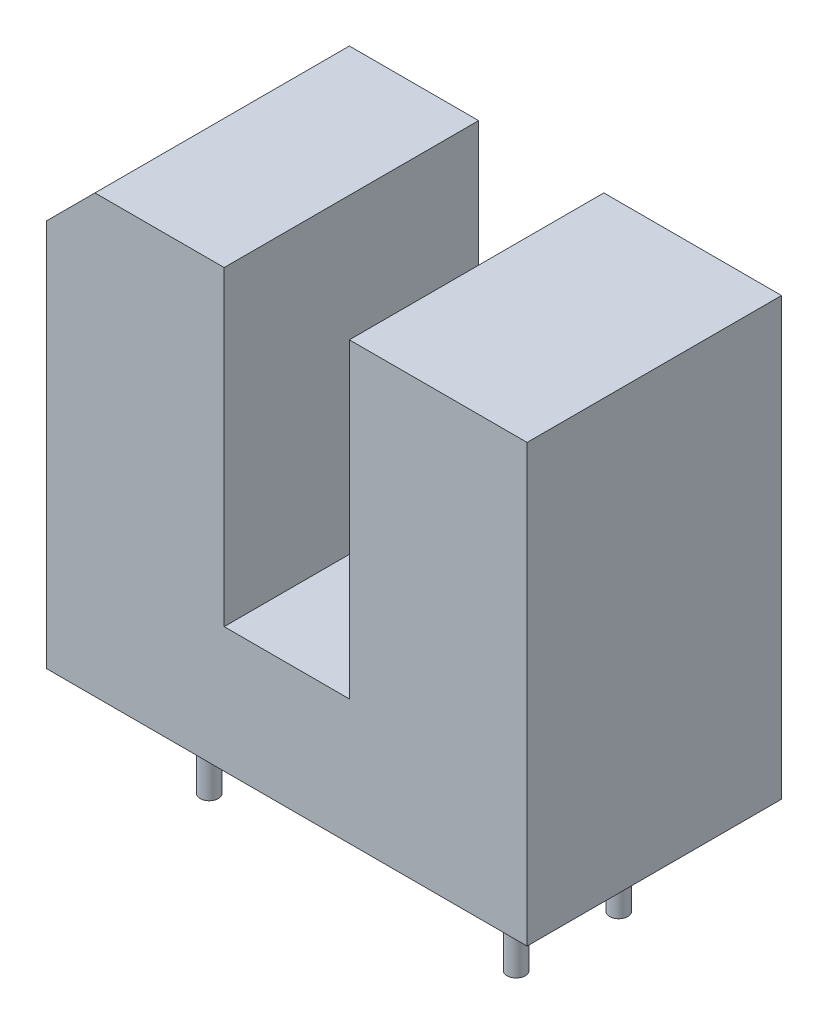
ISO-10303-21;
HEADER;
FILE_DESCRIPTION(('STEP AP214'),'2;1');
FILE_NAME('part.step','',(''),(''),'','','');
FILE_SCHEMA(('AUTOMOTIVE_DESIGN { 1 0 10303 214 1 1 1 1 }'));
ENDSEC;
DATA;
#1=APPLICATION_CONTEXT('core data for automotive mechanical design processes');
#2=APPLICATION_PROTOCOL_DEFINITION('international standard','automotive_design',2000,#1);
#3=PRODUCT_CONTEXT('',#1,'mechanical');
#4=PRODUCT('Part','Part','',(#3));
#5=PRODUCT_RELATED_PRODUCT_CATEGORY('part','',(#4));
#6=PRODUCT_DEFINITION_FORMATION('','',#4);
#7=PRODUCT_DEFINITION_CONTEXT('part definition',#1,'design');
#8=PRODUCT_DEFINITION('design','',#6,#7);
#9=PRODUCT_DEFINITION_SHAPE('','',#8);
#10=(LENGTH_UNIT() NAMED_UNIT(*) SI_UNIT(.MILLI.,.METRE.));
#11=(NAMED_UNIT(*) PLANE_ANGLE_UNIT() SI_UNIT($,.RADIAN.));
#12=(NAMED_UNIT(*) SI_UNIT($,.STERADIAN.) SOLID_ANGLE_UNIT());
#13=UNCERTAINTY_MEASURE_WITH_UNIT(LENGTH_MEASURE(1.E-05),#10,'distance_accuracy_value','');
#14=(GEOMETRIC_REPRESENTATION_CONTEXT(3) GLOBAL_UNCERTAINTY_ASSIGNED_CONTEXT((#13)) GLOBAL_UNIT_ASSIGNED_CONTEXT((#10,
#11,#12)) REPRESENTATION_CONTEXT('',''));
#15=CARTESIAN_POINT('',(0.,0.,0.));
#16=DIRECTION('',(0.,0.,1.));
#17=DIRECTION('',(1.,0.,0.));
#18=AXIS2_PLACEMENT_3D('',#15,#16,#17);
#19=CARTESIAN_POINT('',(0.,3.1,0.));
#20=DIRECTION('',(0.,1.,0.));
#21=DIRECTION('',(0.,0.,1.));
#22=AXIS2_PLACEMENT_3D('',#19,#20,#21);
#23=PLANE('',#22);
#24=DIRECTION('',(1.,0.,0.));
#25=VECTOR('',#24,1.);
#26=CARTESIAN_POINT('',(-5.95,3.1,3.15));
#27=LINE('',#26,#25);
#28=CARTESIAN_POINT('',(-1.55,3.1,3.15));
#29=VERTEX_POINT('',#28);
#30=CARTESIAN_POINT('',(1.55,3.1,3.15));
#31=VERTEX_POINT('',#30);
#32=EDGE_CURVE('E166',#29,#31,#27,.T.);
#33=ORIENTED_EDGE('',*,*,#32,.T.);
#34=DIRECTION('',(0.,0.,1.));
#35=VECTOR('',#34,1.);
#36=CARTESIAN_POINT('',(1.55,3.1,-3.15));
#37=LINE('',#36,#35);
#38=CARTESIAN_POINT('',(1.55,3.1,-3.15));
#39=VERTEX_POINT('',#38);
#40=EDGE_CURVE('E134',#39,#31,#37,.T.);
#41=ORIENTED_EDGE('',*,*,#40,.F.);
#42=DIRECTION('',(-1.,0.,0.));
#43=VECTOR('',#42,1.);
#44=CARTESIAN_POINT('',(-5.95,3.1,-3.15));
#45=LINE('',#44,#43);
#46=CARTESIAN_POINT('',(-1.55,3.1,-3.15));
#47=VERTEX_POINT('',#46);
#48=EDGE_CURVE('E176',#39,#47,#45,.T.);
#49=ORIENTED_EDGE('',*,*,#48,.T.);
#50=DIRECTION('',(0.,0.,-1.));
#51=VECTOR('',#50,1.);
#52=CARTESIAN_POINT('',(-1.55,3.1,-3.15));
#53=LINE('',#52,#51);
#54=EDGE_CURVE('E149',#29,#47,#53,.T.);
#55=ORIENTED_EDGE('',*,*,#54,.F.);
#56=EDGE_LOOP('',(#33,#41,#49,#55));
#57=FACE_BOUND('',#56,.T.);
#58=ADVANCED_FACE('F35',(#57),#23,.T.);
#59=CARTESIAN_POINT('',(5.95,3.1,-3.15));
#60=DIRECTION('',(-1.,0.,0.));
#61=DIRECTION('',(0.,0.,1.));
#62=AXIS2_PLACEMENT_3D('',#59,#60,#61);
#63=PLANE('',#62);
#64=DIRECTION('',(0.,0.,-1.));
#65=VECTOR('',#64,1.);
#66=CARTESIAN_POINT('',(5.95,0.,-3.15));
#67=LINE('',#66,#65);
#68=CARTESIAN_POINT('',(5.95,0.,3.15));
#69=VERTEX_POINT('',#68);
#70=CARTESIAN_POINT('',(5.95,0.,-3.15));
#71=VERTEX_POINT('',#70);
#72=EDGE_CURVE('E114',#69,#71,#67,.T.);
#73=ORIENTED_EDGE('',*,*,#72,.T.);
#74=DIRECTION('',(0.,-1.,0.));
#75=VECTOR('',#74,1.);
#76=CARTESIAN_POINT('',(5.95,3.1,-3.15));
#77=LINE('',#76,#75);
#78=CARTESIAN_POINT('',(5.95,10.8,-3.15));
#79=VERTEX_POINT('',#78);
#80=EDGE_CURVE('E107',#79,#71,#77,.T.);
#81=ORIENTED_EDGE('',*,*,#80,.F.);
#82=DIRECTION('',(0.,0.,-1.));
#83=VECTOR('',#82,1.);
#84=CARTESIAN_POINT('',(5.95,10.8,-3.15));
#85=LINE('',#84,#83);
#86=CARTESIAN_POINT('',(5.95,10.8,3.15));
#87=VERTEX_POINT('',#86);
#88=EDGE_CURVE('E112',#87,#79,#85,.T.);
#89=ORIENTED_EDGE('',*,*,#88,.F.);
#90=DIRECTION('',(0.,-1.,0.));
#91=VECTOR('',#90,1.);
#92=CARTESIAN_POINT('',(5.95,3.1,3.15));
#93=LINE('',#92,#91);
#94=EDGE_CURVE('E217',#87,#69,#93,.T.);
#95=ORIENTED_EDGE('',*,*,#94,.T.);
#96=EDGE_LOOP('',(#73,#81,#89,#95));
#97=FACE_BOUND('',#96,.T.);
#98=ADVANCED_FACE('F109',(#97),#63,.F.);
#99=CARTESIAN_POINT('',(-5.95,3.1,-3.15));
#100=DIRECTION('',(0.,0.,1.));
#101=DIRECTION('',(1.,0.,0.));
#102=AXIS2_PLACEMENT_3D('',#99,#100,#101);
#103=PLANE('',#102);
#104=DIRECTION('',(0.,-1.,0.));
#105=VECTOR('',#104,1.);
#106=CARTESIAN_POINT('',(-5.95,3.1,-3.15));
#107=LINE('',#106,#105);
#108=CARTESIAN_POINT('',(-5.95,9.6,-3.15));
#109=VERTEX_POINT('',#108);
#110=CARTESIAN_POINT('',(-5.95,0.,-3.15));
#111=VERTEX_POINT('',#110);
#112=EDGE_CURVE('E118',#109,#111,#107,.T.);
#113=ORIENTED_EDGE('',*,*,#112,.F.);
#114=DIRECTION('',(0.707106781186546,0.707106781186549,0.));
#115=VECTOR('',#114,1.);
#116=CARTESIAN_POINT('',(-4.75,10.8,-3.15));
#117=LINE('',#116,#115);
#118=CARTESIAN_POINT('',(-4.75,10.8,-3.15));
#119=VERTEX_POINT('',#118);
#120=EDGE_CURVE('E183',#109,#119,#117,.T.);
#121=ORIENTED_EDGE('',*,*,#120,.T.);
#122=DIRECTION('',(-1.,0.,0.));
#123=VECTOR('',#122,1.);
#124=CARTESIAN_POINT('',(-5.95,10.8,-3.15));
#125=LINE('',#124,#123);
#126=CARTESIAN_POINT('',(-1.55,10.8,-3.15));
#127=VERTEX_POINT('',#126);
#128=EDGE_CURVE('E154',#127,#119,#125,.T.);
#129=ORIENTED_EDGE('',*,*,#128,.F.);
#130=DIRECTION('',(0.,-1.,0.));
#131=VECTOR('',#130,1.);
#132=CARTESIAN_POINT('',(-1.55,10.8,-3.15));
#133=LINE('',#132,#131);
#134=EDGE_CURVE('E157',#127,#47,#133,.T.);
#135=ORIENTED_EDGE('',*,*,#134,.T.);
#136=ORIENTED_EDGE('',*,*,#48,.F.);
#137=DIRECTION('',(0.,-1.,0.));
#138=VECTOR('',#137,1.);
#139=CARTESIAN_POINT('',(1.55,10.8,-3.15));
#140=LINE('',#139,#138);
#141=CARTESIAN_POINT('',(1.55,10.8,-3.15));
#142=VERTEX_POINT('',#141);
#143=EDGE_CURVE('E125',#142,#39,#140,.T.);
#144=ORIENTED_EDGE('',*,*,#143,.F.);
#145=DIRECTION('',(-1.,0.,0.));
#146=VECTOR('',#145,1.);
#147=CARTESIAN_POINT('',(5.95,10.8,-3.15));
#148=LINE('',#147,#146);
#149=EDGE_CURVE('E121',#79,#142,#148,.T.);
#150=ORIENTED_EDGE('',*,*,#149,.F.);
#151=ORIENTED_EDGE('',*,*,#80,.T.);
#152=DIRECTION('',(-1.,0.,0.));
#153=VECTOR('',#152,1.);
#154=CARTESIAN_POINT('',(-5.95,0.,-3.15));
#155=LINE('',#154,#153);
#156=EDGE_CURVE('E208',#71,#111,#155,.T.);
#157=ORIENTED_EDGE('',*,*,#156,.T.);
#158=EDGE_LOOP('',(#113,#121,#129,#135,#136,#144,#150,#151,#157));
#159=FACE_BOUND('',#158,.T.);
#160=ADVANCED_FACE('F122',(#159),#103,.F.);
#161=CARTESIAN_POINT('',(-5.95,3.1,-3.15));
#162=DIRECTION('',(1.,0.,0.));
#163=DIRECTION('',(0.,0.,-1.));
#164=AXIS2_PLACEMENT_3D('',#161,#162,#163);
#165=PLANE('',#164);
#166=DIRECTION('',(0.,-1.,0.));
#167=VECTOR('',#166,1.);
#168=CARTESIAN_POINT('',(-5.95,3.1,3.15));
#169=LINE('',#168,#167);
#170=CARTESIAN_POINT('',(-5.95,9.6,3.15));
#171=VERTEX_POINT('',#170);
#172=CARTESIAN_POINT('',(-5.95,0.,3.15));
#173=VERTEX_POINT('',#172);
#174=EDGE_CURVE('E219',#171,#173,#169,.T.);
#175=ORIENTED_EDGE('',*,*,#174,.F.);
#176=DIRECTION('',(0.,0.,-1.));
#177=VECTOR('',#176,1.);
#178=CARTESIAN_POINT('',(-5.95,9.6,-3.15));
#179=LINE('',#178,#177);
#180=EDGE_CURVE('E50',#171,#109,#179,.T.);
#181=ORIENTED_EDGE('',*,*,#180,.T.);
#182=ORIENTED_EDGE('',*,*,#112,.T.);
#183=DIRECTION('',(0.,0.,1.));
#184=VECTOR('',#183,1.);
#185=CARTESIAN_POINT('',(-5.95,0.,-3.15));
#186=LINE('',#185,#184);
#187=EDGE_CURVE('E210',#111,#173,#186,.T.);
#188=ORIENTED_EDGE('',*,*,#187,.T.);
#189=EDGE_LOOP('',(#175,#181,#182,#188));
#190=FACE_BOUND('',#189,.T.);
#191=ADVANCED_FACE('F221',(#190),#165,.F.);
#192=CARTESIAN_POINT('',(-5.95,3.1,3.15));
#193=DIRECTION('',(0.,0.,-1.));
#194=DIRECTION('',(-1.,0.,0.));
#195=AXIS2_PLACEMENT_3D('',#192,#193,#194);
#196=PLANE('',#195);
#197=DIRECTION('',(1.,0.,0.));
#198=VECTOR('',#197,1.);
#199=CARTESIAN_POINT('',(-5.95,10.8,3.15));
#200=LINE('',#199,#198);
#201=CARTESIAN_POINT('',(-4.75,10.8,3.15));
#202=VERTEX_POINT('',#201);
#203=CARTESIAN_POINT('',(-1.55,10.8,3.15));
#204=VERTEX_POINT('',#203);
#205=EDGE_CURVE('E150',#202,#204,#200,.T.);
#206=ORIENTED_EDGE('',*,*,#205,.F.);
#207=DIRECTION('',(-0.707106781186546,-0.707106781186549,0.));
#208=VECTOR('',#207,1.);
#209=CARTESIAN_POINT('',(-4.75,10.8,3.15));
#210=LINE('',#209,#208);
#211=EDGE_CURVE('E58',#202,#171,#210,.T.);
#212=ORIENTED_EDGE('',*,*,#211,.T.);
#213=ORIENTED_EDGE('',*,*,#174,.T.);
#214=DIRECTION('',(1.,0.,0.));
#215=VECTOR('',#214,1.);
#216=CARTESIAN_POINT('',(-5.95,0.,3.15));
#217=LINE('',#216,#215);
#218=EDGE_CURVE('E178',#173,#69,#217,.T.);
#219=ORIENTED_EDGE('',*,*,#218,.T.);
#220=ORIENTED_EDGE('',*,*,#94,.F.);
#221=DIRECTION('',(1.,0.,0.));
#222=VECTOR('',#221,1.);
#223=CARTESIAN_POINT('',(5.95,10.8,3.15));
#224=LINE('',#223,#222);
#225=CARTESIAN_POINT('',(1.55,10.8,3.15));
#226=VERTEX_POINT('',#225);
#227=EDGE_CURVE('E133',#226,#87,#224,.T.);
#228=ORIENTED_EDGE('',*,*,#227,.F.);
#229=DIRECTION('',(0.,-1.,0.));
#230=VECTOR('',#229,1.);
#231=CARTESIAN_POINT('',(1.55,10.8,3.15));
#232=LINE('',#231,#230);
#233=EDGE_CURVE('E144',#226,#31,#232,.T.);
#234=ORIENTED_EDGE('',*,*,#233,.T.);
#235=ORIENTED_EDGE('',*,*,#32,.F.);
#236=DIRECTION('',(0.,-1.,0.));
#237=VECTOR('',#236,1.);
#238=CARTESIAN_POINT('',(-1.55,10.8,3.15));
#239=LINE('',#238,#237);
#240=EDGE_CURVE('E169',#204,#29,#239,.T.);
#241=ORIENTED_EDGE('',*,*,#240,.F.);
#242=EDGE_LOOP('',(#206,#212,#213,#219,#220,#228,#234,#235,#241));
#243=FACE_BOUND('',#242,.T.);
#244=ADVANCED_FACE('F199',(#243),#196,.F.);
#245=CARTESIAN_POINT('',(0.,0.,0.));
#246=DIRECTION('',(0.,1.,0.));
#247=DIRECTION('',(0.,0.,1.));
#248=AXIS2_PLACEMENT_3D('',#245,#246,#247);
#249=PLANE('',#248);
#250=CARTESIAN_POINT('',(3.8,0.,-1.27));
#251=DIRECTION('',(0.,1.,0.));
#252=DIRECTION('',(0.,0.,1.));
#253=AXIS2_PLACEMENT_3D('',#250,#251,#252);
#254=CIRCLE('',#253,0.225);
#255=CARTESIAN_POINT('',(3.8,0.,-1.045));
#256=VERTEX_POINT('',#255);
#257=EDGE_CURVE('E11',#256,#256,#254,.F.);
#258=ORIENTED_EDGE('',*,*,#257,.F.);
#259=EDGE_LOOP('',(#258));
#260=FACE_BOUND('',#259,.T.);
#261=CARTESIAN_POINT('',(3.8,0.,1.27));
#262=DIRECTION('',(0.,1.,0.));
#263=DIRECTION('',(0.,0.,1.));
#264=AXIS2_PLACEMENT_3D('',#261,#262,#263);
#265=CIRCLE('',#264,0.225);
#266=CARTESIAN_POINT('',(3.8,0.,1.495));
#267=VERTEX_POINT('',#266);
#268=EDGE_CURVE('E43',#267,#267,#265,.F.);
#269=ORIENTED_EDGE('',*,*,#268,.F.);
#270=EDGE_LOOP('',(#269));
#271=FACE_BOUND('',#270,.T.);
#272=CARTESIAN_POINT('',(-3.8,0.,-1.27));
#273=DIRECTION('',(0.,1.,0.));
#274=DIRECTION('',(0.,0.,1.));
#275=AXIS2_PLACEMENT_3D('',#272,#273,#274);
#276=CIRCLE('',#275,0.225);
#277=CARTESIAN_POINT('',(-3.8,0.,-1.045));
#278=VERTEX_POINT('',#277);
#279=EDGE_CURVE('E188',#278,#278,#276,.F.);
#280=ORIENTED_EDGE('',*,*,#279,.F.);
#281=EDGE_LOOP('',(#280));
#282=FACE_BOUND('',#281,.T.);
#283=CARTESIAN_POINT('',(-3.8,0.,1.27));
#284=DIRECTION('',(0.,1.,0.));
#285=DIRECTION('',(0.,0.,1.));
#286=AXIS2_PLACEMENT_3D('',#283,#284,#285);
#287=CIRCLE('',#286,0.225);
#288=CARTESIAN_POINT('',(-3.8,0.,1.495));
#289=VERTEX_POINT('',#288);
#290=EDGE_CURVE('E185',#289,#289,#287,.F.);
#291=ORIENTED_EDGE('',*,*,#290,.F.);
#292=EDGE_LOOP('',(#291));
#293=FACE_BOUND('',#292,.T.);
#294=ORIENTED_EDGE('',*,*,#72,.F.);
#295=ORIENTED_EDGE('',*,*,#218,.F.);
#296=ORIENTED_EDGE('',*,*,#187,.F.);
#297=ORIENTED_EDGE('',*,*,#156,.F.);
#298=EDGE_LOOP('',(#294,#295,#296,#297));
#299=FACE_BOUND('',#298,.T.);
#300=ADVANCED_FACE('F195',(#260,#271,#282,#293,#299),#249,.F.);
#301=CARTESIAN_POINT('',(-1.55,10.8,-3.15));
#302=DIRECTION('',(-1.,0.,0.));
#303=DIRECTION('',(0.,0.,1.));
#304=AXIS2_PLACEMENT_3D('',#301,#302,#303);
#305=PLANE('',#304);
#306=ORIENTED_EDGE('',*,*,#54,.T.);
#307=ORIENTED_EDGE('',*,*,#134,.F.);
#308=DIRECTION('',(0.,0.,-1.));
#309=VECTOR('',#308,1.);
#310=CARTESIAN_POINT('',(-1.55,10.8,-3.15));
#311=LINE('',#310,#309);
#312=EDGE_CURVE('E152',#204,#127,#311,.T.);
#313=ORIENTED_EDGE('',*,*,#312,.F.);
#314=ORIENTED_EDGE('',*,*,#240,.T.);
#315=EDGE_LOOP('',(#306,#307,#313,#314));
#316=FACE_BOUND('',#315,.T.);
#317=ADVANCED_FACE('F198',(#316),#305,.F.);
#318=CARTESIAN_POINT('',(0.,10.8,0.));
#319=DIRECTION('',(0.,1.,0.));
#320=DIRECTION('',(0.,0.,1.));
#321=AXIS2_PLACEMENT_3D('',#318,#319,#320);
#322=PLANE('',#321);
#323=ORIENTED_EDGE('',*,*,#128,.T.);
#324=DIRECTION('',(0.,0.,1.));
#325=VECTOR('',#324,1.);
#326=CARTESIAN_POINT('',(-4.75,10.8,3.15));
#327=LINE('',#326,#325);
#328=EDGE_CURVE('E117',#119,#202,#327,.T.);
#329=ORIENTED_EDGE('',*,*,#328,.T.);
#330=ORIENTED_EDGE('',*,*,#205,.T.);
#331=ORIENTED_EDGE('',*,*,#312,.T.);
#332=EDGE_LOOP('',(#323,#329,#330,#331));
#333=FACE_BOUND('',#332,.T.);
#334=ADVANCED_FACE('F227',(#333),#322,.T.);
#335=CARTESIAN_POINT('',(1.55,10.8,-3.15));
#336=DIRECTION('',(1.,0.,0.));
#337=DIRECTION('',(0.,0.,-1.));
#338=AXIS2_PLACEMENT_3D('',#335,#336,#337);
#339=PLANE('',#338);
#340=CARTESIAN_POINT('',(1.55,8.2,0.));
#341=DIRECTION('',(-1.,0.,0.));
#342=DIRECTION('',(0.,0.,1.));
#343=AXIS2_PLACEMENT_3D('',#340,#341,#342);
#344=CIRCLE('',#343,0.5);
#345=CARTESIAN_POINT('',(1.55,8.2,0.5));
#346=VERTEX_POINT('',#345);
#347=EDGE_CURVE('E140',#346,#346,#344,.T.);
#348=ORIENTED_EDGE('',*,*,#347,.F.);
#349=EDGE_LOOP('',(#348));
#350=FACE_BOUND('',#349,.T.);
#351=ORIENTED_EDGE('',*,*,#40,.T.);
#352=ORIENTED_EDGE('',*,*,#233,.F.);
#353=DIRECTION('',(0.,0.,1.));
#354=VECTOR('',#353,1.);
#355=CARTESIAN_POINT('',(1.55,10.8,-3.15));
#356=LINE('',#355,#354);
#357=EDGE_CURVE('E128',#142,#226,#356,.T.);
#358=ORIENTED_EDGE('',*,*,#357,.F.);
#359=ORIENTED_EDGE('',*,*,#143,.T.);
#360=EDGE_LOOP('',(#351,#352,#358,#359));
#361=FACE_BOUND('',#360,.T.);
#362=ADVANCED_FACE('F235',(#350,#361),#339,.F.);
#363=CARTESIAN_POINT('',(0.,10.8,0.));
#364=DIRECTION('',(0.,-1.,0.));
#365=DIRECTION('',(0.,0.,-1.));
#366=AXIS2_PLACEMENT_3D('',#363,#364,#365);
#367=PLANE('',#366);
#368=ORIENTED_EDGE('',*,*,#88,.T.);
#369=ORIENTED_EDGE('',*,*,#149,.T.);
#370=ORIENTED_EDGE('',*,*,#357,.T.);
#371=ORIENTED_EDGE('',*,*,#227,.T.);
#372=EDGE_LOOP('',(#368,#369,#370,#371));
#373=FACE_BOUND('',#372,.T.);
#374=ADVANCED_FACE('F131',(#373),#367,.F.);
#375=CARTESIAN_POINT('',(2.55,8.2,0.));
#376=DIRECTION('',(-1.,0.,0.));
#377=DIRECTION('',(0.,0.,1.));
#378=AXIS2_PLACEMENT_3D('',#375,#376,#377);
#379=CYLINDRICAL_SURFACE('',#378,0.5);
#380=CARTESIAN_POINT('',(2.55,8.2,0.));
#381=DIRECTION('',(-1.,0.,0.));
#382=DIRECTION('',(0.,0.,1.));
#383=AXIS2_PLACEMENT_3D('',#380,#381,#382);
#384=CIRCLE('',#383,0.5);
#385=CARTESIAN_POINT('',(2.55,8.2,0.500000000000001));
#386=VERTEX_POINT('',#385);
#387=EDGE_CURVE('E137',#386,#386,#384,.T.);
#388=ORIENTED_EDGE('',*,*,#387,.F.);
#389=EDGE_LOOP('',(#388));
#390=FACE_BOUND('',#389,.T.);
#391=ORIENTED_EDGE('',*,*,#347,.T.);
#392=EDGE_LOOP('',(#391));
#393=FACE_BOUND('',#392,.T.);
#394=ADVANCED_FACE('F368',(#390,#393),#379,.F.);
#395=CARTESIAN_POINT('',(2.55,8.2,0.));
#396=DIRECTION('',(-1.,0.,0.));
#397=DIRECTION('',(0.,0.,1.));
#398=AXIS2_PLACEMENT_3D('',#395,#396,#397);
#399=PLANE('',#398);
#400=ORIENTED_EDGE('',*,*,#387,.T.);
#401=EDGE_LOOP('',(#400));
#402=FACE_BOUND('',#401,.T.);
#403=ADVANCED_FACE('F256',(#402),#399,.T.);
#404=CARTESIAN_POINT('',(-4.75,10.8,0.));
#405=DIRECTION('',(-0.707106781186549,0.707106781186546,0.));
#406=DIRECTION('',(0.,0.,-1.));
#407=AXIS2_PLACEMENT_3D('',#404,#405,#406);
#408=PLANE('',#407);
#409=ORIENTED_EDGE('',*,*,#120,.F.);
#410=ORIENTED_EDGE('',*,*,#180,.F.);
#411=ORIENTED_EDGE('',*,*,#211,.F.);
#412=ORIENTED_EDGE('',*,*,#328,.F.);
#413=EDGE_LOOP('',(#409,#410,#411,#412));
#414=FACE_BOUND('',#413,.T.);
#415=ADVANCED_FACE('F37',(#414),#408,.T.);
#416=CARTESIAN_POINT('',(-3.8,-2.54,1.27));
#417=DIRECTION('',(0.,1.,0.));
#418=DIRECTION('',(0.,0.,1.));
#419=AXIS2_PLACEMENT_3D('',#416,#417,#418);
#420=CYLINDRICAL_SURFACE('',#419,0.225);
#421=CARTESIAN_POINT('',(-3.8,-2.54,1.27));
#422=DIRECTION('',(0.,-1.,0.));
#423=DIRECTION('',(0.,0.,-1.));
#424=AXIS2_PLACEMENT_3D('',#421,#422,#423);
#425=CIRCLE('',#424,0.225);
#426=CARTESIAN_POINT('',(-3.8,-2.54,1.045));
#427=VERTEX_POINT('',#426);
#428=EDGE_CURVE('E382',#427,#427,#425,.T.);
#429=ORIENTED_EDGE('',*,*,#428,.F.);
#430=EDGE_LOOP('',(#429));
#431=FACE_BOUND('',#430,.T.);
#432=ORIENTED_EDGE('',*,*,#290,.T.);
#433=EDGE_LOOP('',(#432));
#434=FACE_BOUND('',#433,.T.);
#435=ADVANCED_FACE('F280',(#431,#434),#420,.T.);
#436=CARTESIAN_POINT('',(-3.8,-2.54,1.27));
#437=DIRECTION('',(0.,-1.,0.));
#438=DIRECTION('',(0.,0.,-1.));
#439=AXIS2_PLACEMENT_3D('',#436,#437,#438);
#440=PLANE('',#439);
#441=ORIENTED_EDGE('',*,*,#428,.T.);
#442=EDGE_LOOP('',(#441));
#443=FACE_BOUND('',#442,.T.);
#444=ADVANCED_FACE('F292',(#443),#440,.T.);
#445=CARTESIAN_POINT('',(-3.8,-2.54,-1.27));
#446=DIRECTION('',(0.,1.,0.));
#447=DIRECTION('',(0.,0.,1.));
#448=AXIS2_PLACEMENT_3D('',#445,#446,#447);
#449=CYLINDRICAL_SURFACE('',#448,0.225);
#450=CARTESIAN_POINT('',(-3.8,-2.54,-1.27));
#451=DIRECTION('',(0.,-1.,0.));
#452=DIRECTION('',(0.,0.,-1.));
#453=AXIS2_PLACEMENT_3D('',#450,#451,#452);
#454=CIRCLE('',#453,0.225);
#455=CARTESIAN_POINT('',(-3.8,-2.54,-1.495));
#456=VERTEX_POINT('',#455);
#457=EDGE_CURVE('E385',#456,#456,#454,.T.);
#458=ORIENTED_EDGE('',*,*,#457,.F.);
#459=EDGE_LOOP('',(#458));
#460=FACE_BOUND('',#459,.T.);
#461=ORIENTED_EDGE('',*,*,#279,.T.);
#462=EDGE_LOOP('',(#461));
#463=FACE_BOUND('',#462,.T.);
#464=ADVANCED_FACE('F302',(#460,#463),#449,.T.);
#465=CARTESIAN_POINT('',(-3.8,-2.54,-1.27));
#466=DIRECTION('',(0.,-1.,0.));
#467=DIRECTION('',(0.,0.,-1.));
#468=AXIS2_PLACEMENT_3D('',#465,#466,#467);
#469=PLANE('',#468);
#470=ORIENTED_EDGE('',*,*,#457,.T.);
#471=EDGE_LOOP('',(#470));
#472=FACE_BOUND('',#471,.T.);
#473=ADVANCED_FACE('F312',(#472),#469,.T.);
#474=CARTESIAN_POINT('',(3.8,-2.54,1.27));
#475=DIRECTION('',(0.,1.,0.));
#476=DIRECTION('',(0.,0.,1.));
#477=AXIS2_PLACEMENT_3D('',#474,#475,#476);
#478=CYLINDRICAL_SURFACE('',#477,0.225);
#479=CARTESIAN_POINT('',(3.8,-2.54,1.27));
#480=DIRECTION('',(0.,-1.,0.));
#481=DIRECTION('',(0.,0.,-1.));
#482=AXIS2_PLACEMENT_3D('',#479,#480,#481);
#483=CIRCLE('',#482,0.225);
#484=CARTESIAN_POINT('',(3.8,-2.54,1.045));
#485=VERTEX_POINT('',#484);
#486=EDGE_CURVE('E389',#485,#485,#483,.T.);
#487=ORIENTED_EDGE('',*,*,#486,.F.);
#488=EDGE_LOOP('',(#487));
#489=FACE_BOUND('',#488,.T.);
#490=ORIENTED_EDGE('',*,*,#268,.T.);
#491=EDGE_LOOP('',(#490));
#492=FACE_BOUND('',#491,.T.);
#493=ADVANCED_FACE('F193',(#489,#492),#478,.T.);
#494=CARTESIAN_POINT('',(3.8,-2.54,1.27));
#495=DIRECTION('',(0.,-1.,0.));
#496=DIRECTION('',(0.,0.,-1.));
#497=AXIS2_PLACEMENT_3D('',#494,#495,#496);
#498=PLANE('',#497);
#499=ORIENTED_EDGE('',*,*,#486,.T.);
#500=EDGE_LOOP('',(#499));
#501=FACE_BOUND('',#500,.T.);
#502=ADVANCED_FACE('F331',(#501),#498,.T.);
#503=CARTESIAN_POINT('',(3.8,-2.54,-1.27));
#504=DIRECTION('',(0.,1.,0.));
#505=DIRECTION('',(0.,0.,1.));
#506=AXIS2_PLACEMENT_3D('',#503,#504,#505);
#507=CYLINDRICAL_SURFACE('',#506,0.225);
#508=CARTESIAN_POINT('',(3.8,-2.54,-1.27));
#509=DIRECTION('',(0.,-1.,0.));
#510=DIRECTION('',(0.,0.,-1.));
#511=AXIS2_PLACEMENT_3D('',#508,#509,#510);
#512=CIRCLE('',#511,0.225);
#513=CARTESIAN_POINT('',(3.8,-2.54,-1.495));
#514=VERTEX_POINT('',#513);
#515=EDGE_CURVE('E394',#514,#514,#512,.T.);
#516=ORIENTED_EDGE('',*,*,#515,.F.);
#517=EDGE_LOOP('',(#516));
#518=FACE_BOUND('',#517,.T.);
#519=ORIENTED_EDGE('',*,*,#257,.T.);
#520=EDGE_LOOP('',(#519));
#521=FACE_BOUND('',#520,.T.);
#522=ADVANCED_FACE('F341',(#518,#521),#507,.T.);
#523=CARTESIAN_POINT('',(3.8,-2.54,-1.27));
#524=DIRECTION('',(0.,-1.,0.));
#525=DIRECTION('',(0.,0.,-1.));
#526=AXIS2_PLACEMENT_3D('',#523,#524,#525);
#527=PLANE('',#526);
#528=ORIENTED_EDGE('',*,*,#515,.T.);
#529=EDGE_LOOP('',(#528));
#530=FACE_BOUND('',#529,.T.);
#531=ADVANCED_FACE('F351',(#530),#527,.T.);
#532=CLOSED_SHELL('',(#58,#98,#160,#191,#244,#300,#317,#334,#362,#374,#394,#403,#415,#435,#444,
#464,#473,#493,#502,#522,#531));
#533=MANIFOLD_SOLID_BREP('B2',#532);
#534=ADVANCED_BREP_SHAPE_REPRESENTATION('',(#18,#533),#14);
#535=SHAPE_DEFINITION_REPRESENTATION(#9,#534);
ENDSEC;
END-ISO-10303-21;
